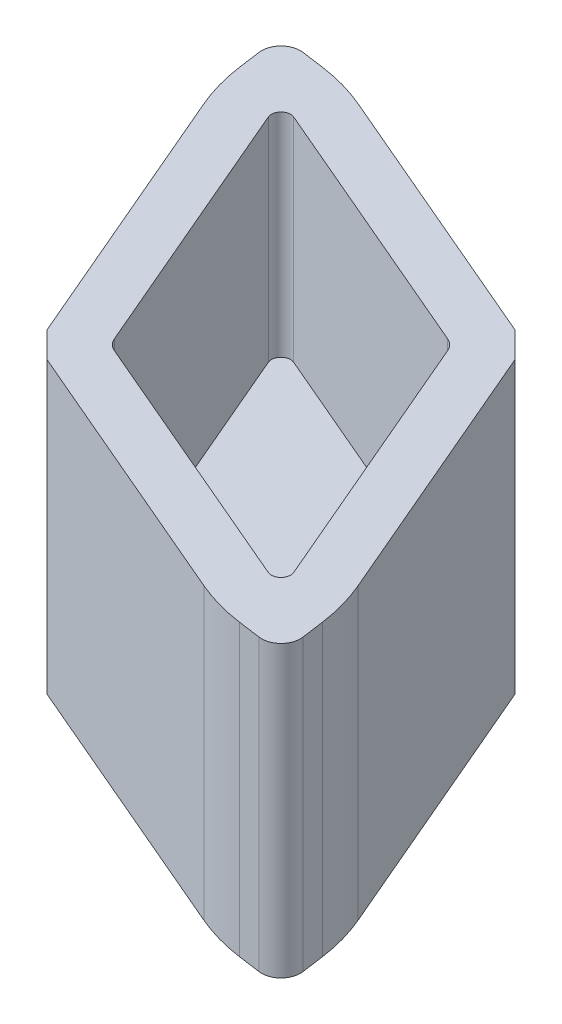
ISO-10303-21;
HEADER;
FILE_DESCRIPTION(('STEP AP214'),'2;1');
FILE_NAME('part.step','',(''),(''),'','','');
FILE_SCHEMA(('AUTOMOTIVE_DESIGN { 1 0 10303 214 1 1 1 1 }'));
ENDSEC;
DATA;
#1=APPLICATION_CONTEXT('core data for automotive mechanical design processes');
#2=APPLICATION_PROTOCOL_DEFINITION('international standard','automotive_design',2000,#1);
#3=PRODUCT_CONTEXT('',#1,'mechanical');
#4=PRODUCT('Part','Part','',(#3));
#5=PRODUCT_RELATED_PRODUCT_CATEGORY('part','',(#4));
#6=PRODUCT_DEFINITION_FORMATION('','',#4);
#7=PRODUCT_DEFINITION_CONTEXT('part definition',#1,'design');
#8=PRODUCT_DEFINITION('design','',#6,#7);
#9=PRODUCT_DEFINITION_SHAPE('','',#8);
#10=(LENGTH_UNIT() NAMED_UNIT(*) SI_UNIT(.MILLI.,.METRE.));
#11=(NAMED_UNIT(*) PLANE_ANGLE_UNIT() SI_UNIT($,.RADIAN.));
#12=(NAMED_UNIT(*) SI_UNIT($,.STERADIAN.) SOLID_ANGLE_UNIT());
#13=UNCERTAINTY_MEASURE_WITH_UNIT(LENGTH_MEASURE(1.E-05),#10,'distance_accuracy_value','');
#14=(GEOMETRIC_REPRESENTATION_CONTEXT(3) GLOBAL_UNCERTAINTY_ASSIGNED_CONTEXT((#13)) GLOBAL_UNIT_ASSIGNED_CONTEXT((#10,
#11,#12)) REPRESENTATION_CONTEXT('',''));
#15=CARTESIAN_POINT('',(0.,0.,0.));
#16=DIRECTION('',(0.,0.,1.));
#17=DIRECTION('',(1.,0.,0.));
#18=AXIS2_PLACEMENT_3D('',#15,#16,#17);
#19=CARTESIAN_POINT('',(-28.0411898687564,15.,-21.4741639325516));
#20=DIRECTION('',(0.,-1.,0.));
#21=DIRECTION('',(0.,0.,-1.));
#22=AXIS2_PLACEMENT_3D('',#19,#20,#21);
#23=CYLINDRICAL_SURFACE('',#22,10.);
#24=CARTESIAN_POINT('',(-28.0411898687564,0.,-21.4741639325516));
#25=DIRECTION('',(0.,1.,0.));
#26=DIRECTION('',(0.,0.,1.));
#27=AXIS2_PLACEMENT_3D('',#24,#25,#26);
#28=CIRCLE('',#27,10.);
#29=CARTESIAN_POINT('',(-37.9459062470632,0.,-20.0969952917164));
#30=VERTEX_POINT('',#29);
#31=CARTESIAN_POINT('',(-37.2348151155173,0.,-17.5400496965234));
#32=VERTEX_POINT('',#31);
#33=EDGE_CURVE('E369',#30,#32,#28,.T.);
#34=ORIENTED_EDGE('',*,*,#33,.T.);
#35=DIRECTION('',(0.,-1.,0.));
#36=VECTOR('',#35,1.);
#37=CARTESIAN_POINT('',(-37.2348151155173,15.,-17.5400496965234));
#38=LINE('',#37,#36);
#39=CARTESIAN_POINT('',(-37.2348151155173,15.,-17.5400496965234));
#40=VERTEX_POINT('',#39);
#41=EDGE_CURVE('E508',#40,#32,#38,.T.);
#42=ORIENTED_EDGE('',*,*,#41,.F.);
#43=CARTESIAN_POINT('',(-28.0411898687564,15.,-21.4741639325516));
#44=DIRECTION('',(0.,1.,0.));
#45=DIRECTION('',(0.,0.,1.));
#46=AXIS2_PLACEMENT_3D('',#43,#44,#45);
#47=CIRCLE('',#46,10.);
#48=CARTESIAN_POINT('',(-37.9459062470632,15.,-20.0969952917164));
#49=VERTEX_POINT('',#48);
#50=EDGE_CURVE('E390',#49,#40,#47,.T.);
#51=ORIENTED_EDGE('',*,*,#50,.F.);
#52=DIRECTION('',(0.,-1.,0.));
#53=VECTOR('',#52,1.);
#54=CARTESIAN_POINT('',(-37.9459062470632,15.,-20.0969952917164));
#55=LINE('',#54,#53);
#56=EDGE_CURVE('E432',#49,#30,#55,.T.);
#57=ORIENTED_EDGE('',*,*,#56,.T.);
#58=EDGE_LOOP('',(#34,#42,#51,#57));
#59=FACE_BOUND('',#58,.T.);
#60=ADVANCED_FACE('F104',(#59),#23,.T.);
#61=CARTESIAN_POINT('',(-37.2348151155173,15.,-17.5400496965234));
#62=DIRECTION('',(0.919362524676096,0.,-0.393411423602816));
#63=DIRECTION('',(-0.393411423602816,0.,-0.919362524676096));
#64=AXIS2_PLACEMENT_3D('',#61,#62,#63);
#65=PLANE('',#64);
#66=DIRECTION('',(0.393411423602816,0.,0.919362524676096));
#67=VECTOR('',#66,1.);
#68=CARTESIAN_POINT('',(-37.2348151155173,0.,-17.5400496965234));
#69=LINE('',#68,#67);
#70=CARTESIAN_POINT('',(-31.1500782062889,0.,-3.32063777495764));
#71=VERTEX_POINT('',#70);
#72=EDGE_CURVE('E435',#32,#71,#69,.T.);
#73=ORIENTED_EDGE('',*,*,#72,.T.);
#74=DIRECTION('',(0.,-1.,0.));
#75=VECTOR('',#74,1.);
#76=CARTESIAN_POINT('',(-31.1500782062889,15.,-3.32063777495764));
#77=LINE('',#76,#75);
#78=CARTESIAN_POINT('',(-31.1500782062889,15.,-3.32063777495764));
#79=VERTEX_POINT('',#78);
#80=EDGE_CURVE('E506',#79,#71,#77,.T.);
#81=ORIENTED_EDGE('',*,*,#80,.F.);
#82=DIRECTION('',(0.393411423602816,0.,0.919362524676096));
#83=VECTOR('',#82,1.);
#84=CARTESIAN_POINT('',(-37.2348151155173,15.,-17.5400496965234));
#85=LINE('',#84,#83);
#86=EDGE_CURVE('E393',#40,#79,#85,.T.);
#87=ORIENTED_EDGE('',*,*,#86,.F.);
#88=ORIENTED_EDGE('',*,*,#41,.T.);
#89=EDGE_LOOP('',(#73,#81,#87,#88));
#90=FACE_BOUND('',#89,.T.);
#91=ADVANCED_FACE('F544',(#90),#65,.F.);
#92=CARTESIAN_POINT('',(-29.8352004536057,15.,-2.00576002227444));
#93=DIRECTION('',(-0.707106781186545,0.,0.70710678118655));
#94=DIRECTION('',(0.70710678118655,0.,0.707106781186545));
#95=AXIS2_PLACEMENT_3D('',#92,#93,#94);
#96=PLANE('',#95);
#97=DIRECTION('',(-0.70710678118655,0.,-0.707106781186545));
#98=VECTOR('',#97,1.);
#99=CARTESIAN_POINT('',(-29.8352004536057,0.,-2.00576002227444));
#100=LINE('',#99,#98);
#101=CARTESIAN_POINT('',(-29.8352004536057,0.,-2.00576002227444));
#102=VERTEX_POINT('',#101);
#103=EDGE_CURVE('E438',#102,#71,#100,.T.);
#104=ORIENTED_EDGE('',*,*,#103,.F.);
#105=DIRECTION('',(0.,-1.,0.));
#106=VECTOR('',#105,1.);
#107=CARTESIAN_POINT('',(-29.8352004536057,15.,-2.00576002227444));
#108=LINE('',#107,#106);
#109=CARTESIAN_POINT('',(-29.8352004536057,15.,-2.00576002227444));
#110=VERTEX_POINT('',#109);
#111=EDGE_CURVE('E504',#110,#102,#108,.T.);
#112=ORIENTED_EDGE('',*,*,#111,.F.);
#113=DIRECTION('',(-0.70710678118655,0.,-0.707106781186545));
#114=VECTOR('',#113,1.);
#115=CARTESIAN_POINT('',(-29.8352004536057,15.,-2.00576002227444));
#116=LINE('',#115,#114);
#117=EDGE_CURVE('E396',#110,#79,#116,.T.);
#118=ORIENTED_EDGE('',*,*,#117,.T.);
#119=ORIENTED_EDGE('',*,*,#80,.T.);
#120=EDGE_LOOP('',(#104,#112,#118,#119));
#121=FACE_BOUND('',#120,.T.);
#122=ADVANCED_FACE('F549',(#121),#96,.T.);
#123=CARTESIAN_POINT('',(-29.8352004536057,15.,-2.00576002227444));
#124=DIRECTION('',(0.393411423602818,0.,-0.919362524676095));
#125=DIRECTION('',(-0.919362524676095,0.,-0.393411423602818));
#126=AXIS2_PLACEMENT_3D('',#123,#124,#125);
#127=PLANE('',#126);
#128=DIRECTION('',(0.919362524676095,0.,0.393411423602818));
#129=VECTOR('',#128,1.);
#130=CARTESIAN_POINT('',(-29.8352004536057,0.,-2.00576002227444));
#131=LINE('',#130,#129);
#132=CARTESIAN_POINT('',(-15.61578853204,0.,4.07897688695399));
#133=VERTEX_POINT('',#132);
#134=EDGE_CURVE('E441',#102,#133,#131,.T.);
#135=ORIENTED_EDGE('',*,*,#134,.T.);
#136=DIRECTION('',(0.,-1.,0.));
#137=VECTOR('',#136,1.);
#138=CARTESIAN_POINT('',(-15.61578853204,15.,4.07897688695399));
#139=LINE('',#138,#137);
#140=CARTESIAN_POINT('',(-15.61578853204,15.,4.07897688695399));
#141=VERTEX_POINT('',#140);
#142=EDGE_CURVE('E502',#141,#133,#139,.T.);
#143=ORIENTED_EDGE('',*,*,#142,.F.);
#144=DIRECTION('',(0.919362524676095,0.,0.393411423602818));
#145=VECTOR('',#144,1.);
#146=CARTESIAN_POINT('',(-29.8352004536057,15.,-2.00576002227444));
#147=LINE('',#146,#145);
#148=EDGE_CURVE('E399',#110,#141,#147,.T.);
#149=ORIENTED_EDGE('',*,*,#148,.F.);
#150=ORIENTED_EDGE('',*,*,#111,.T.);
#151=EDGE_LOOP('',(#135,#143,#149,#150));
#152=FACE_BOUND('',#151,.T.);
#153=ADVANCED_FACE('F615',(#152),#127,.F.);
#154=CARTESIAN_POINT('',(-11.6816742960118,15.,-5.11464835980695));
#155=DIRECTION('',(0.,-1.,0.));
#156=DIRECTION('',(0.,0.,-1.));
#157=AXIS2_PLACEMENT_3D('',#154,#155,#156);
#158=CYLINDRICAL_SURFACE('',#157,10.);
#159=CARTESIAN_POINT('',(-11.6816742960118,0.,-5.11464835980695));
#160=DIRECTION('',(0.,-1.,0.));
#161=DIRECTION('',(0.,0.,-1.));
#162=AXIS2_PLACEMENT_3D('',#159,#160,#161);
#163=CIRCLE('',#162,10.);
#164=CARTESIAN_POINT('',(-13.0588429368471,0.,4.79006801849989));
#165=VERTEX_POINT('',#164);
#166=EDGE_CURVE('E444',#165,#133,#163,.T.);
#167=ORIENTED_EDGE('',*,*,#166,.F.);
#168=DIRECTION('',(0.,-1.,0.));
#169=VECTOR('',#168,1.);
#170=CARTESIAN_POINT('',(-13.0588429368471,15.,4.79006801849989));
#171=LINE('',#170,#169);
#172=CARTESIAN_POINT('',(-13.0588429368471,15.,4.79006801849989));
#173=VERTEX_POINT('',#172);
#174=EDGE_CURVE('E500',#173,#165,#171,.T.);
#175=ORIENTED_EDGE('',*,*,#174,.F.);
#176=CARTESIAN_POINT('',(-11.6816742960118,15.,-5.11464835980695));
#177=DIRECTION('',(0.,-1.,0.));
#178=DIRECTION('',(0.,0.,-1.));
#179=AXIS2_PLACEMENT_3D('',#176,#177,#178);
#180=CIRCLE('',#179,10.);
#181=EDGE_CURVE('E401',#173,#141,#180,.T.);
#182=ORIENTED_EDGE('',*,*,#181,.T.);
#183=ORIENTED_EDGE('',*,*,#142,.T.);
#184=EDGE_LOOP('',(#167,#175,#182,#183));
#185=FACE_BOUND('',#184,.T.);
#186=ADVANCED_FACE('F609',(#185),#158,.T.);
#187=CARTESIAN_POINT('',(-13.0588429368471,15.,4.79006801849989));
#188=DIRECTION('',(0.137716864083533,0.,-0.990471637830684));
#189=DIRECTION('',(-0.990471637830684,0.,-0.137716864083533));
#190=AXIS2_PLACEMENT_3D('',#187,#188,#189);
#191=PLANE('',#190);
#192=DIRECTION('',(0.990471637830684,0.,0.137716864083533));
#193=VECTOR('',#192,1.);
#194=CARTESIAN_POINT('',(-13.0588429368471,0.,4.79006801849989));
#195=LINE('',#194,#193);
#196=CARTESIAN_POINT('',(-11.8833485347486,0.,4.95351076296788));
#197=VERTEX_POINT('',#196);
#198=EDGE_CURVE('E447',#165,#197,#195,.T.);
#199=ORIENTED_EDGE('',*,*,#198,.T.);
#200=DIRECTION('',(0.,-1.,0.));
#201=VECTOR('',#200,1.);
#202=CARTESIAN_POINT('',(-11.8833485347486,15.,4.95351076296788));
#203=LINE('',#202,#201);
#204=CARTESIAN_POINT('',(-11.8833485347486,15.,4.95351076296788));
#205=VERTEX_POINT('',#204);
#206=EDGE_CURVE('E498',#205,#197,#203,.T.);
#207=ORIENTED_EDGE('',*,*,#206,.F.);
#208=DIRECTION('',(0.990471637830684,0.,0.137716864083533));
#209=VECTOR('',#208,1.);
#210=CARTESIAN_POINT('',(-13.0588429368471,15.,4.79006801849989));
#211=LINE('',#210,#209);
#212=EDGE_CURVE('E404',#173,#205,#211,.T.);
#213=ORIENTED_EDGE('',*,*,#212,.F.);
#214=ORIENTED_EDGE('',*,*,#174,.T.);
#215=EDGE_LOOP('',(#199,#207,#213,#214));
#216=FACE_BOUND('',#215,.T.);
#217=ADVANCED_FACE('F617',(#216),#191,.F.);
#218=CARTESIAN_POINT('',(-11.7456316706651,15.,3.9630391251372));
#219=DIRECTION('',(0.,-1.,0.));
#220=DIRECTION('',(0.,0.,-1.));
#221=AXIS2_PLACEMENT_3D('',#218,#219,#220);
#222=CYLINDRICAL_SURFACE('',#221,1.);
#223=CARTESIAN_POINT('',(-11.7456316706651,0.,3.9630391251372));
#224=DIRECTION('',(0.,-1.,0.));
#225=DIRECTION('',(0.,0.,-1.));
#226=AXIS2_PLACEMENT_3D('',#223,#224,#225);
#227=CIRCLE('',#226,1.);
#228=CARTESIAN_POINT('',(-10.7551600328344,0.,3.82532226105365));
#229=VERTEX_POINT('',#228);
#230=EDGE_CURVE('E450',#229,#197,#227,.T.);
#231=ORIENTED_EDGE('',*,*,#230,.F.);
#232=DIRECTION('',(0.,-1.,0.));
#233=VECTOR('',#232,1.);
#234=CARTESIAN_POINT('',(-10.7551600328344,15.,3.82532226105365));
#235=LINE('',#234,#233);
#236=CARTESIAN_POINT('',(-10.7551600328344,15.,3.82532226105365));
#237=VERTEX_POINT('',#236);
#238=EDGE_CURVE('E496',#237,#229,#235,.T.);
#239=ORIENTED_EDGE('',*,*,#238,.F.);
#240=CARTESIAN_POINT('',(-11.7456316706651,15.,3.9630391251372));
#241=DIRECTION('',(0.,-1.,0.));
#242=DIRECTION('',(0.,0.,-1.));
#243=AXIS2_PLACEMENT_3D('',#240,#241,#242);
#244=CIRCLE('',#243,1.);
#245=EDGE_CURVE('E406',#237,#205,#244,.T.);
#246=ORIENTED_EDGE('',*,*,#245,.T.);
#247=ORIENTED_EDGE('',*,*,#206,.T.);
#248=EDGE_LOOP('',(#231,#239,#246,#247));
#249=FACE_BOUND('',#248,.T.);
#250=ADVANCED_FACE('F603',(#249),#222,.T.);
#251=CARTESIAN_POINT('',(-10.7551600328344,15.,3.82532226105365));
#252=DIRECTION('',(-0.990471637830683,0.,0.137716864083543));
#253=DIRECTION('',(0.137716864083543,0.,0.990471637830683));
#254=AXIS2_PLACEMENT_3D('',#251,#252,#253);
#255=PLANE('',#254);
#256=DIRECTION('',(-0.137716864083543,0.,-0.990471637830683));
#257=VECTOR('',#256,1.);
#258=CARTESIAN_POINT('',(-10.7551600328344,0.,3.82532226105365));
#259=LINE('',#258,#257);
#260=CARTESIAN_POINT('',(-10.9186027773024,0.,2.64982785895507));
#261=VERTEX_POINT('',#260);
#262=EDGE_CURVE('E453',#229,#261,#259,.T.);
#263=ORIENTED_EDGE('',*,*,#262,.T.);
#264=DIRECTION('',(0.,-1.,0.));
#265=VECTOR('',#264,1.);
#266=CARTESIAN_POINT('',(-10.9186027773024,15.,2.64982785895507));
#267=LINE('',#266,#265);
#268=CARTESIAN_POINT('',(-10.9186027773024,15.,2.64982785895507));
#269=VERTEX_POINT('',#268);
#270=EDGE_CURVE('E493',#269,#261,#267,.T.);
#271=ORIENTED_EDGE('',*,*,#270,.F.);
#272=DIRECTION('',(-0.137716864083543,0.,-0.990471637830683));
#273=VECTOR('',#272,1.);
#274=CARTESIAN_POINT('',(-10.7551600328344,15.,3.82532226105365));
#275=LINE('',#274,#273);
#276=EDGE_CURVE('E409',#237,#269,#275,.T.);
#277=ORIENTED_EDGE('',*,*,#276,.F.);
#278=ORIENTED_EDGE('',*,*,#238,.T.);
#279=EDGE_LOOP('',(#263,#271,#277,#278));
#280=FACE_BOUND('',#279,.T.);
#281=ADVANCED_FACE('F600',(#280),#255,.F.);
#282=CARTESIAN_POINT('',(-20.8233191556092,15.,4.02699649979045));
#283=DIRECTION('',(0.,-1.,0.));
#284=DIRECTION('',(0.,0.,-1.));
#285=AXIS2_PLACEMENT_3D('',#282,#283,#284);
#286=CYLINDRICAL_SURFACE('',#285,10.);
#287=CARTESIAN_POINT('',(-20.8233191556092,0.,4.02699649979045));
#288=DIRECTION('',(0.,1.,0.));
#289=DIRECTION('',(0.,0.,1.));
#290=AXIS2_PLACEMENT_3D('',#287,#288,#289);
#291=CIRCLE('',#290,10.);
#292=CARTESIAN_POINT('',(-11.6296939088483,0.,0.0928822637622697));
#293=VERTEX_POINT('',#292);
#294=EDGE_CURVE('E455',#261,#293,#291,.T.);
#295=ORIENTED_EDGE('',*,*,#294,.T.);
#296=DIRECTION('',(0.,-1.,0.));
#297=VECTOR('',#296,1.);
#298=CARTESIAN_POINT('',(-11.6296939088483,15.,0.0928822637622697));
#299=LINE('',#298,#297);
#300=CARTESIAN_POINT('',(-11.6296939088483,15.,0.0928822637622697));
#301=VERTEX_POINT('',#300);
#302=EDGE_CURVE('E491',#301,#293,#299,.T.);
#303=ORIENTED_EDGE('',*,*,#302,.F.);
#304=CARTESIAN_POINT('',(-20.8233191556092,15.,4.02699649979045));
#305=DIRECTION('',(0.,1.,0.));
#306=DIRECTION('',(0.,0.,1.));
#307=AXIS2_PLACEMENT_3D('',#304,#305,#306);
#308=CIRCLE('',#307,10.);
#309=EDGE_CURVE('E411',#269,#301,#308,.T.);
#310=ORIENTED_EDGE('',*,*,#309,.F.);
#311=ORIENTED_EDGE('',*,*,#270,.T.);
#312=EDGE_LOOP('',(#295,#303,#310,#311));
#313=FACE_BOUND('',#312,.T.);
#314=ADVANCED_FACE('F595',(#313),#286,.T.);
#315=CARTESIAN_POINT('',(-17.7144308180767,15.,-14.1265296578036));
#316=DIRECTION('',(0.919362524676095,0.,-0.393411423602818));
#317=DIRECTION('',(-0.393411423602818,0.,-0.919362524676095));
#318=AXIS2_PLACEMENT_3D('',#315,#316,#317);
#319=PLANE('',#318);
#320=DIRECTION('',(0.393411423602818,0.,0.919362524676095));
#321=VECTOR('',#320,1.);
#322=CARTESIAN_POINT('',(-17.7144308180767,0.,-14.1265296578036));
#323=LINE('',#322,#321);
#324=CARTESIAN_POINT('',(-17.7144308180767,0.,-14.1265296578036));
#325=VERTEX_POINT('',#324);
#326=EDGE_CURVE('E458',#325,#293,#323,.T.);
#327=ORIENTED_EDGE('',*,*,#326,.F.);
#328=DIRECTION('',(0.,-1.,0.));
#329=VECTOR('',#328,1.);
#330=CARTESIAN_POINT('',(-17.7144308180767,15.,-14.1265296578036));
#331=LINE('',#330,#329);
#332=CARTESIAN_POINT('',(-17.7144308180767,15.,-14.1265296578036));
#333=VERTEX_POINT('',#332);
#334=EDGE_CURVE('E489',#333,#325,#331,.T.);
#335=ORIENTED_EDGE('',*,*,#334,.F.);
#336=DIRECTION('',(0.393411423602818,0.,0.919362524676095));
#337=VECTOR('',#336,1.);
#338=CARTESIAN_POINT('',(-17.7144308180767,15.,-14.1265296578036));
#339=LINE('',#338,#337);
#340=EDGE_CURVE('E413',#333,#301,#339,.T.);
#341=ORIENTED_EDGE('',*,*,#340,.T.);
#342=ORIENTED_EDGE('',*,*,#302,.T.);
#343=EDGE_LOOP('',(#327,#335,#341,#342));
#344=FACE_BOUND('',#343,.T.);
#345=ADVANCED_FACE('F589',(#344),#319,.T.);
#346=CARTESIAN_POINT('',(-19.0293085707598,15.,-15.4414074104866));
#347=DIRECTION('',(0.70710678118653,0.,-0.707106781186565));
#348=DIRECTION('',(-0.707106781186565,0.,-0.70710678118653));
#349=AXIS2_PLACEMENT_3D('',#346,#347,#348);
#350=PLANE('',#349);
#351=DIRECTION('',(0.707106781186565,0.,0.70710678118653));
#352=VECTOR('',#351,1.);
#353=CARTESIAN_POINT('',(-19.0293085707598,0.,-15.4414074104866));
#354=LINE('',#353,#352);
#355=CARTESIAN_POINT('',(-19.0293085707598,0.,-15.4414074104866));
#356=VERTEX_POINT('',#355);
#357=EDGE_CURVE('E461',#356,#325,#354,.T.);
#358=ORIENTED_EDGE('',*,*,#357,.F.);
#359=DIRECTION('',(0.,-1.,0.));
#360=VECTOR('',#359,1.);
#361=CARTESIAN_POINT('',(-19.0293085707598,15.,-15.4414074104866));
#362=LINE('',#361,#360);
#363=CARTESIAN_POINT('',(-19.0293085707598,15.,-15.4414074104866));
#364=VERTEX_POINT('',#363);
#365=EDGE_CURVE('E487',#364,#356,#362,.T.);
#366=ORIENTED_EDGE('',*,*,#365,.F.);
#367=DIRECTION('',(0.707106781186565,0.,0.70710678118653));
#368=VECTOR('',#367,1.);
#369=CARTESIAN_POINT('',(-19.0293085707598,15.,-15.4414074104866));
#370=LINE('',#369,#368);
#371=EDGE_CURVE('E416',#364,#333,#370,.T.);
#372=ORIENTED_EDGE('',*,*,#371,.T.);
#373=ORIENTED_EDGE('',*,*,#334,.T.);
#374=EDGE_LOOP('',(#358,#366,#372,#373));
#375=FACE_BOUND('',#374,.T.);
#376=ADVANCED_FACE('F585',(#375),#350,.T.);
#377=CARTESIAN_POINT('',(-33.2487204923257,15.,-21.5261443197151));
#378=DIRECTION('',(0.39341142360282,0.,-0.919362524676095));
#379=DIRECTION('',(-0.919362524676095,0.,-0.39341142360282));
#380=AXIS2_PLACEMENT_3D('',#377,#378,#379);
#381=PLANE('',#380);
#382=DIRECTION('',(0.919362524676095,0.,0.39341142360282));
#383=VECTOR('',#382,1.);
#384=CARTESIAN_POINT('',(-33.2487204923257,0.,-21.5261443197151));
#385=LINE('',#384,#383);
#386=CARTESIAN_POINT('',(-33.2487204923257,0.,-21.5261443197151));
#387=VERTEX_POINT('',#386);
#388=EDGE_CURVE('E464',#387,#356,#385,.T.);
#389=ORIENTED_EDGE('',*,*,#388,.F.);
#390=DIRECTION('',(0.,-1.,0.));
#391=VECTOR('',#390,1.);
#392=CARTESIAN_POINT('',(-33.2487204923257,15.,-21.5261443197151));
#393=LINE('',#392,#391);
#394=CARTESIAN_POINT('',(-33.2487204923257,15.,-21.5261443197151));
#395=VERTEX_POINT('',#394);
#396=EDGE_CURVE('E485',#395,#387,#393,.T.);
#397=ORIENTED_EDGE('',*,*,#396,.F.);
#398=DIRECTION('',(0.919362524676095,0.,0.39341142360282));
#399=VECTOR('',#398,1.);
#400=CARTESIAN_POINT('',(-33.2487204923257,15.,-21.5261443197151));
#401=LINE('',#400,#399);
#402=EDGE_CURVE('E419',#395,#364,#401,.T.);
#403=ORIENTED_EDGE('',*,*,#402,.T.);
#404=ORIENTED_EDGE('',*,*,#365,.T.);
#405=EDGE_LOOP('',(#389,#397,#403,#404));
#406=FACE_BOUND('',#405,.T.);
#407=ADVANCED_FACE('F581',(#406),#381,.T.);
#408=CARTESIAN_POINT('',(-37.1828347283539,15.,-12.3325190729542));
#409=DIRECTION('',(0.,-1.,0.));
#410=DIRECTION('',(0.,0.,-1.));
#411=AXIS2_PLACEMENT_3D('',#408,#409,#410);
#412=CYLINDRICAL_SURFACE('',#411,10.);
#413=CARTESIAN_POINT('',(-37.1828347283539,0.,-12.3325190729542));
#414=DIRECTION('',(0.,-1.,0.));
#415=DIRECTION('',(0.,0.,-1.));
#416=AXIS2_PLACEMENT_3D('',#413,#414,#415);
#417=CIRCLE('',#416,10.);
#418=CARTESIAN_POINT('',(-35.8056660875186,0.,-22.237235451261));
#419=VERTEX_POINT('',#418);
#420=EDGE_CURVE('E467',#419,#387,#417,.T.);
#421=ORIENTED_EDGE('',*,*,#420,.F.);
#422=DIRECTION('',(0.,-1.,0.));
#423=VECTOR('',#422,1.);
#424=CARTESIAN_POINT('',(-35.8056660875186,15.,-22.237235451261));
#425=LINE('',#424,#423);
#426=CARTESIAN_POINT('',(-35.8056660875186,15.,-22.237235451261));
#427=VERTEX_POINT('',#426);
#428=EDGE_CURVE('E483',#427,#419,#425,.T.);
#429=ORIENTED_EDGE('',*,*,#428,.F.);
#430=CARTESIAN_POINT('',(-37.1828347283539,15.,-12.3325190729542));
#431=DIRECTION('',(0.,-1.,0.));
#432=DIRECTION('',(0.,0.,-1.));
#433=AXIS2_PLACEMENT_3D('',#430,#431,#432);
#434=CIRCLE('',#433,10.);
#435=EDGE_CURVE('E422',#427,#395,#434,.T.);
#436=ORIENTED_EDGE('',*,*,#435,.T.);
#437=ORIENTED_EDGE('',*,*,#396,.T.);
#438=EDGE_LOOP('',(#421,#429,#436,#437));
#439=FACE_BOUND('',#438,.T.);
#440=ADVANCED_FACE('F577',(#439),#412,.T.);
#441=CARTESIAN_POINT('',(-36.981160489617,15.,-22.400678195729));
#442=DIRECTION('',(0.137716864083534,0.,-0.990471637830684));
#443=DIRECTION('',(-0.990471637830684,0.,-0.137716864083534));
#444=AXIS2_PLACEMENT_3D('',#441,#442,#443);
#445=PLANE('',#444);
#446=DIRECTION('',(0.990471637830684,0.,0.137716864083534));
#447=VECTOR('',#446,1.);
#448=CARTESIAN_POINT('',(-36.981160489617,0.,-22.400678195729));
#449=LINE('',#448,#447);
#450=CARTESIAN_POINT('',(-36.981160489617,0.,-22.400678195729));
#451=VERTEX_POINT('',#450);
#452=EDGE_CURVE('E470',#451,#419,#449,.T.);
#453=ORIENTED_EDGE('',*,*,#452,.F.);
#454=DIRECTION('',(0.,-1.,0.));
#455=VECTOR('',#454,1.);
#456=CARTESIAN_POINT('',(-36.981160489617,15.,-22.400678195729));
#457=LINE('',#456,#455);
#458=CARTESIAN_POINT('',(-36.981160489617,15.,-22.400678195729));
#459=VERTEX_POINT('',#458);
#460=EDGE_CURVE('E481',#459,#451,#457,.T.);
#461=ORIENTED_EDGE('',*,*,#460,.F.);
#462=DIRECTION('',(0.990471637830684,0.,0.137716864083534));
#463=VECTOR('',#462,1.);
#464=CARTESIAN_POINT('',(-36.981160489617,15.,-22.400678195729));
#465=LINE('',#464,#463);
#466=EDGE_CURVE('E425',#459,#427,#465,.T.);
#467=ORIENTED_EDGE('',*,*,#466,.T.);
#468=ORIENTED_EDGE('',*,*,#428,.T.);
#469=EDGE_LOOP('',(#453,#461,#467,#468));
#470=FACE_BOUND('',#469,.T.);
#471=ADVANCED_FACE('F573',(#470),#445,.T.);
#472=CARTESIAN_POINT('',(-37.1188773537005,15.,-21.4102065578983));
#473=DIRECTION('',(0.,-1.,0.));
#474=DIRECTION('',(0.,0.,-1.));
#475=AXIS2_PLACEMENT_3D('',#472,#473,#474);
#476=CYLINDRICAL_SURFACE('',#475,1.);
#477=CARTESIAN_POINT('',(-37.1188773537005,0.,-21.4102065578983));
#478=DIRECTION('',(0.,1.,0.));
#479=DIRECTION('',(0.,0.,1.));
#480=AXIS2_PLACEMENT_3D('',#477,#478,#479);
#481=CIRCLE('',#480,1.);
#482=CARTESIAN_POINT('',(-38.1093489915312,0.,-21.2724896938148));
#483=VERTEX_POINT('',#482);
#484=EDGE_CURVE('E473',#451,#483,#481,.T.);
#485=ORIENTED_EDGE('',*,*,#484,.T.);
#486=DIRECTION('',(0.,-1.,0.));
#487=VECTOR('',#486,1.);
#488=CARTESIAN_POINT('',(-38.1093489915312,15.,-21.2724896938148));
#489=LINE('',#488,#487);
#490=CARTESIAN_POINT('',(-38.1093489915312,15.,-21.2724896938148));
#491=VERTEX_POINT('',#490);
#492=EDGE_CURVE('E478',#491,#483,#489,.T.);
#493=ORIENTED_EDGE('',*,*,#492,.F.);
#494=CARTESIAN_POINT('',(-37.1188773537005,15.,-21.4102065578983));
#495=DIRECTION('',(0.,1.,0.));
#496=DIRECTION('',(0.,0.,1.));
#497=AXIS2_PLACEMENT_3D('',#494,#495,#496);
#498=CIRCLE('',#497,1.);
#499=EDGE_CURVE('E428',#459,#491,#498,.T.);
#500=ORIENTED_EDGE('',*,*,#499,.F.);
#501=ORIENTED_EDGE('',*,*,#460,.T.);
#502=EDGE_LOOP('',(#485,#493,#500,#501));
#503=FACE_BOUND('',#502,.T.);
#504=ADVANCED_FACE('F570',(#503),#476,.T.);
#505=CARTESIAN_POINT('',(-38.1093489915312,15.,-21.2724896938148));
#506=DIRECTION('',(0.990471637830685,0.,-0.137716864083527));
#507=DIRECTION('',(-0.137716864083527,0.,-0.990471637830685));
#508=AXIS2_PLACEMENT_3D('',#505,#506,#507);
#509=PLANE('',#508);
#510=DIRECTION('',(0.137716864083527,0.,0.990471637830685));
#511=VECTOR('',#510,1.);
#512=CARTESIAN_POINT('',(-38.1093489915312,0.,-21.2724896938148));
#513=LINE('',#512,#511);
#514=EDGE_CURVE('E394',#483,#30,#513,.T.);
#515=ORIENTED_EDGE('',*,*,#514,.T.);
#516=ORIENTED_EDGE('',*,*,#56,.F.);
#517=DIRECTION('',(0.137716864083527,0.,0.990471637830685));
#518=VECTOR('',#517,1.);
#519=CARTESIAN_POINT('',(-38.1093489915312,15.,-21.2724896938148));
#520=LINE('',#519,#518);
#521=EDGE_CURVE('E430',#491,#49,#520,.T.);
#522=ORIENTED_EDGE('',*,*,#521,.F.);
#523=ORIENTED_EDGE('',*,*,#492,.T.);
#524=EDGE_LOOP('',(#515,#516,#522,#523));
#525=FACE_BOUND('',#524,.T.);
#526=ADVANCED_FACE('F568',(#525),#509,.F.);
#527=CARTESIAN_POINT('',(-28.0411898687564,15.,-21.4741639325516));
#528=DIRECTION('',(0.,1.,0.));
#529=DIRECTION('',(0.,0.,1.));
#530=AXIS2_PLACEMENT_3D('',#527,#528,#529);
#531=PLANE('',#530);
#532=CARTESIAN_POINT('',(-34.5124615796985,15.,-18.8037907838964));
#533=DIRECTION('',(0.,-1.,0.));
#534=DIRECTION('',(0.,0.,-1.));
#535=AXIS2_PLACEMENT_3D('',#532,#533,#534);
#536=CIRCLE('',#535,0.499999999999999);
#537=CARTESIAN_POINT('',(-34.9721428420366,15.,-18.607085072095));
#538=VERTEX_POINT('',#537);
#539=CARTESIAN_POINT('',(-34.3157558678971,15.,-19.2634720462344));
#540=VERTEX_POINT('',#539);
#541=EDGE_CURVE('E343',#538,#540,#536,.T.);
#542=ORIENTED_EDGE('',*,*,#541,.T.);
#543=DIRECTION('',(0.919362524676095,0.,0.393411423602819));
#544=VECTOR('',#543,1.);
#545=CARTESIAN_POINT('',(-34.3157558678971,15.,-19.2634720462344));
#546=LINE('',#545,#544);
#547=CARTESIAN_POINT('',(-20.381171474589,15.,-13.3006178550476));
#548=VERTEX_POINT('',#547);
#549=EDGE_CURVE('E346',#540,#548,#546,.T.);
#550=ORIENTED_EDGE('',*,*,#549,.T.);
#551=CARTESIAN_POINT('',(-20.7745828981919,15.,-12.3812553303715));
#552=DIRECTION('',(0.,-1.,0.));
#553=DIRECTION('',(0.,0.,-1.));
#554=AXIS2_PLACEMENT_3D('',#551,#552,#553);
#555=CIRCLE('',#554,0.999999999999998);
#556=CARTESIAN_POINT('',(-19.8552203735158,15.,-12.7746667539743));
#557=VERTEX_POINT('',#556);
#558=EDGE_CURVE('E349',#548,#557,#555,.T.);
#559=ORIENTED_EDGE('',*,*,#558,.T.);
#560=DIRECTION('',(0.393411423602817,0.,0.919362524676096));
#561=VECTOR('',#560,1.);
#562=CARTESIAN_POINT('',(-19.8552203735158,15.,-12.7746667539743));
#563=LINE('',#562,#561);
#564=CARTESIAN_POINT('',(-13.892366182329,15.,1.15991763933381));
#565=VERTEX_POINT('',#564);
#566=EDGE_CURVE('E352',#557,#565,#563,.T.);
#567=ORIENTED_EDGE('',*,*,#566,.T.);
#568=CARTESIAN_POINT('',(-14.352047444667,15.,1.35662335113523));
#569=DIRECTION('',(0.,1.,0.));
#570=DIRECTION('',(0.,0.,1.));
#571=AXIS2_PLACEMENT_3D('',#568,#569,#570);
#572=CIRCLE('',#571,0.5);
#573=CARTESIAN_POINT('',(-14.5487531564684,15.,1.81630461347328));
#574=VERTEX_POINT('',#573);
#575=EDGE_CURVE('E355',#574,#565,#572,.T.);
#576=ORIENTED_EDGE('',*,*,#575,.F.);
#577=DIRECTION('',(-0.919362524676094,0.,-0.39341142360282));
#578=VECTOR('',#577,1.);
#579=CARTESIAN_POINT('',(-14.5487531564684,15.,1.81630461347328));
#580=LINE('',#579,#578);
#581=CARTESIAN_POINT('',(-28.4833375497765,15.,-4.14654957771358));
#582=VERTEX_POINT('',#581);
#583=EDGE_CURVE('E357',#574,#582,#580,.T.);
#584=ORIENTED_EDGE('',*,*,#583,.T.);
#585=CARTESIAN_POINT('',(-28.0899261261737,15.,-5.06591210238967));
#586=DIRECTION('',(0.,-1.,0.));
#587=DIRECTION('',(0.,0.,-1.));
#588=AXIS2_PLACEMENT_3D('',#585,#586,#587);
#589=CIRCLE('',#588,1.);
#590=CARTESIAN_POINT('',(-29.0092886508498,15.,-4.67250067878686));
#591=VERTEX_POINT('',#590);
#592=EDGE_CURVE('E360',#582,#591,#589,.T.);
#593=ORIENTED_EDGE('',*,*,#592,.T.);
#594=DIRECTION('',(0.393411423602817,0.,0.919362524676096));
#595=VECTOR('',#594,1.);
#596=CARTESIAN_POINT('',(-34.9721428420366,15.,-18.607085072095));
#597=LINE('',#596,#595);
#598=EDGE_CURVE('E363',#538,#591,#597,.T.);
#599=ORIENTED_EDGE('',*,*,#598,.F.);
#600=EDGE_LOOP('',(#542,#550,#559,#567,#576,#584,#593,#599));
#601=FACE_BOUND('',#600,.T.);
#602=ORIENTED_EDGE('',*,*,#50,.T.);
#603=ORIENTED_EDGE('',*,*,#86,.T.);
#604=ORIENTED_EDGE('',*,*,#117,.F.);
#605=ORIENTED_EDGE('',*,*,#148,.T.);
#606=ORIENTED_EDGE('',*,*,#181,.F.);
#607=ORIENTED_EDGE('',*,*,#212,.T.);
#608=ORIENTED_EDGE('',*,*,#245,.F.);
#609=ORIENTED_EDGE('',*,*,#276,.T.);
#610=ORIENTED_EDGE('',*,*,#309,.T.);
#611=ORIENTED_EDGE('',*,*,#340,.F.);
#612=ORIENTED_EDGE('',*,*,#371,.F.);
#613=ORIENTED_EDGE('',*,*,#402,.F.);
#614=ORIENTED_EDGE('',*,*,#435,.F.);
#615=ORIENTED_EDGE('',*,*,#466,.F.);
#616=ORIENTED_EDGE('',*,*,#499,.T.);
#617=ORIENTED_EDGE('',*,*,#521,.T.);
#618=EDGE_LOOP('',(#602,#603,#604,#605,#606,#607,#608,#609,#610,#611,#612,#613,#614,#615,#616,#617));
#619=FACE_BOUND('',#618,.T.);
#620=ADVANCED_FACE('F562',(#601,#619),#531,.T.);
#621=CARTESIAN_POINT('',(-28.0411898687564,0.,-21.4741639325516));
#622=DIRECTION('',(0.,1.,0.));
#623=DIRECTION('',(0.,0.,1.));
#624=AXIS2_PLACEMENT_3D('',#621,#622,#623);
#625=PLANE('',#624);
#626=DIRECTION('',(0.938431418926496,0.,0.345465587246551));
#627=VECTOR('',#626,1.);
#628=CARTESIAN_POINT('',(-34.2343746042675,0.,-4.65084099222113));
#629=LINE('',#628,#627);
#630=CARTESIAN_POINT('',(-29.4926926885068,0.,-2.90528143983693));
#631=VERTEX_POINT('',#630);
#632=CARTESIAN_POINT('',(-12.8652167067003,0.,3.21580598182436));
#633=VERTEX_POINT('',#632);
#634=EDGE_CURVE('E513',#631,#633,#629,.T.);
#635=ORIENTED_EDGE('',*,*,#634,.T.);
#636=DIRECTION('',(-0.334172662683435,0.,-0.942511873408003));
#637=VECTOR('',#636,1.);
#638=CARTESIAN_POINT('',(-22.3363333529383,0.,-23.4968515462626));
#639=LINE('',#638,#637);
#640=CARTESIAN_POINT('',(-18.9099520525815,0.,-13.8329699095152));
#641=VERTEX_POINT('',#640);
#642=EDGE_CURVE('E12',#633,#641,#639,.T.);
#643=ORIENTED_EDGE('',*,*,#642,.T.);
#644=DIRECTION('',(-0.908148679362959,0.,-0.418647794896037));
#645=VECTOR('',#644,1.);
#646=CARTESIAN_POINT('',(-29.3459340574595,0.,-18.6438571058514));
#647=LINE('',#646,#645);
#648=CARTESIAN_POINT('',(-32.1738463111956,0.,-19.94749741948));
#649=VERTEX_POINT('',#648);
#650=EDGE_CURVE('E111',#641,#649,#647,.T.);
#651=ORIENTED_EDGE('',*,*,#650,.T.);
#652=DIRECTION('',(-1.,0.,0.));
#653=VECTOR('',#652,1.);
#654=CARTESIAN_POINT('',(-28.0411898687564,0.,-19.94749741948));
#655=LINE('',#654,#653);
#656=CARTESIAN_POINT('',(-36.4840141970149,0.,-19.94749741948));
#657=VERTEX_POINT('',#656);
#658=EDGE_CURVE('E518',#649,#657,#655,.T.);
#659=ORIENTED_EDGE('',*,*,#658,.T.);
#660=DIRECTION('',(0.379539774997088,0.,0.925175420769035));
#661=VECTOR('',#660,1.);
#662=CARTESIAN_POINT('',(-35.803896640066,0.,-18.2896262597909));
#663=LINE('',#662,#661);
#664=EDGE_CURVE('E515',#657,#631,#663,.T.);
#665=ORIENTED_EDGE('',*,*,#664,.T.);
#666=EDGE_LOOP('',(#635,#643,#651,#659,#665));
#667=FACE_BOUND('',#666,.T.);
#668=ORIENTED_EDGE('',*,*,#33,.F.);
#669=ORIENTED_EDGE('',*,*,#514,.F.);
#670=ORIENTED_EDGE('',*,*,#484,.F.);
#671=ORIENTED_EDGE('',*,*,#452,.T.);
#672=ORIENTED_EDGE('',*,*,#420,.T.);
#673=ORIENTED_EDGE('',*,*,#388,.T.);
#674=ORIENTED_EDGE('',*,*,#357,.T.);
#675=ORIENTED_EDGE('',*,*,#326,.T.);
#676=ORIENTED_EDGE('',*,*,#294,.F.);
#677=ORIENTED_EDGE('',*,*,#262,.F.);
#678=ORIENTED_EDGE('',*,*,#230,.T.);
#679=ORIENTED_EDGE('',*,*,#198,.F.);
#680=ORIENTED_EDGE('',*,*,#166,.T.);
#681=ORIENTED_EDGE('',*,*,#134,.F.);
#682=ORIENTED_EDGE('',*,*,#103,.T.);
#683=ORIENTED_EDGE('',*,*,#72,.F.);
#684=EDGE_LOOP('',(#668,#669,#670,#671,#672,#673,#674,#675,#676,#677,#678,#679,#680,#681,#682,#683));
#685=FACE_BOUND('',#684,.T.);
#686=ADVANCED_FACE('F526',(#667,#685),#625,.F.);
#687=CARTESIAN_POINT('',(-34.5124615796985,15.,-18.8037907838964));
#688=DIRECTION('',(0.,-1.,0.));
#689=DIRECTION('',(0.,0.,-1.));
#690=AXIS2_PLACEMENT_3D('',#687,#688,#689);
#691=CYLINDRICAL_SURFACE('',#690,0.499999999999999);
#692=DIRECTION('',(0.,-1.,0.));
#693=VECTOR('',#692,1.);
#694=CARTESIAN_POINT('',(-34.9721428420366,15.,-18.607085072095));
#695=LINE('',#694,#693);
#696=CARTESIAN_POINT('',(-34.9721428420366,4.,-18.607085072095));
#697=VERTEX_POINT('',#696);
#698=EDGE_CURVE('E366',#538,#697,#695,.T.);
#699=ORIENTED_EDGE('',*,*,#698,.T.);
#700=CARTESIAN_POINT('',(-34.5124615796985,4.,-18.8037907838964));
#701=DIRECTION('',(0.,1.,0.));
#702=DIRECTION('',(0.,0.,1.));
#703=AXIS2_PLACEMENT_3D('',#700,#701,#702);
#704=CIRCLE('',#703,0.499999999999999);
#705=CARTESIAN_POINT('',(-34.3157558678971,4.,-19.2634720462344));
#706=VERTEX_POINT('',#705);
#707=EDGE_CURVE('E340',#697,#706,#704,.F.);
#708=ORIENTED_EDGE('',*,*,#707,.T.);
#709=DIRECTION('',(0.,-1.,0.));
#710=VECTOR('',#709,1.);
#711=CARTESIAN_POINT('',(-34.3157558678971,15.,-19.2634720462344));
#712=LINE('',#711,#710);
#713=EDGE_CURVE('E365',#540,#706,#712,.T.);
#714=ORIENTED_EDGE('',*,*,#713,.F.);
#715=ORIENTED_EDGE('',*,*,#541,.F.);
#716=EDGE_LOOP('',(#699,#708,#714,#715));
#717=FACE_BOUND('',#716,.T.);
#718=ADVANCED_FACE('F742',(#717),#691,.F.);
#719=CARTESIAN_POINT('',(-34.9721428420366,15.,-18.607085072095));
#720=DIRECTION('',(0.919362524676096,0.,-0.393411423602817));
#721=DIRECTION('',(-0.393411423602817,0.,-0.919362524676096));
#722=AXIS2_PLACEMENT_3D('',#719,#720,#721);
#723=PLANE('',#722);
#724=DIRECTION('',(0.393411423602817,0.,0.919362524676096));
#725=VECTOR('',#724,1.);
#726=CARTESIAN_POINT('',(-34.9721428420366,4.,-18.607085072095));
#727=LINE('',#726,#725);
#728=CARTESIAN_POINT('',(-29.0092886508498,4.,-4.67250067878686));
#729=VERTEX_POINT('',#728);
#730=EDGE_CURVE('E338',#697,#729,#727,.T.);
#731=ORIENTED_EDGE('',*,*,#730,.F.);
#732=ORIENTED_EDGE('',*,*,#698,.F.);
#733=ORIENTED_EDGE('',*,*,#598,.T.);
#734=DIRECTION('',(0.,-1.,0.));
#735=VECTOR('',#734,1.);
#736=CARTESIAN_POINT('',(-29.0092886508498,15.,-4.67250067878686));
#737=LINE('',#736,#735);
#738=EDGE_CURVE('E370',#591,#729,#737,.T.);
#739=ORIENTED_EDGE('',*,*,#738,.T.);
#740=EDGE_LOOP('',(#731,#732,#733,#739));
#741=FACE_BOUND('',#740,.T.);
#742=ADVANCED_FACE('F748',(#741),#723,.T.);
#743=CARTESIAN_POINT('',(-28.0899261261737,15.,-5.06591210238967));
#744=DIRECTION('',(0.,-1.,0.));
#745=DIRECTION('',(0.,0.,-1.));
#746=AXIS2_PLACEMENT_3D('',#743,#744,#745);
#747=CYLINDRICAL_SURFACE('',#746,1.);
#748=DIRECTION('',(0.,-1.,0.));
#749=VECTOR('',#748,1.);
#750=CARTESIAN_POINT('',(-28.4833375497765,15.,-4.14654957771358));
#751=LINE('',#750,#749);
#752=CARTESIAN_POINT('',(-28.4833375497765,4.,-4.14654957771358));
#753=VERTEX_POINT('',#752);
#754=EDGE_CURVE('E373',#582,#753,#751,.T.);
#755=ORIENTED_EDGE('',*,*,#754,.T.);
#756=CARTESIAN_POINT('',(-28.0899261261737,4.,-5.06591210238967));
#757=DIRECTION('',(0.,1.,0.));
#758=DIRECTION('',(0.,0.,1.));
#759=AXIS2_PLACEMENT_3D('',#756,#757,#758);
#760=CIRCLE('',#759,1.);
#761=EDGE_CURVE('E335',#753,#729,#760,.F.);
#762=ORIENTED_EDGE('',*,*,#761,.T.);
#763=ORIENTED_EDGE('',*,*,#738,.F.);
#764=ORIENTED_EDGE('',*,*,#592,.F.);
#765=EDGE_LOOP('',(#755,#762,#763,#764));
#766=FACE_BOUND('',#765,.T.);
#767=ADVANCED_FACE('F756',(#766),#747,.F.);
#768=CARTESIAN_POINT('',(-14.5487531564684,15.,1.81630461347328));
#769=DIRECTION('',(-0.39341142360282,0.,0.919362524676094));
#770=DIRECTION('',(0.919362524676095,0.,0.39341142360282));
#771=AXIS2_PLACEMENT_3D('',#768,#769,#770);
#772=PLANE('',#771);
#773=DIRECTION('',(0.,-1.,0.));
#774=VECTOR('',#773,1.);
#775=CARTESIAN_POINT('',(-14.5487531564684,15.,1.81630461347328));
#776=LINE('',#775,#774);
#777=CARTESIAN_POINT('',(-14.5487531564684,4.,1.81630461347327));
#778=VERTEX_POINT('',#777);
#779=EDGE_CURVE('E376',#574,#778,#776,.T.);
#780=ORIENTED_EDGE('',*,*,#779,.T.);
#781=DIRECTION('',(-0.919362524676095,0.,-0.39341142360282));
#782=VECTOR('',#781,1.);
#783=CARTESIAN_POINT('',(-14.5487531564684,4.,1.81630461347328));
#784=LINE('',#783,#782);
#785=EDGE_CURVE('E332',#778,#753,#784,.T.);
#786=ORIENTED_EDGE('',*,*,#785,.T.);
#787=ORIENTED_EDGE('',*,*,#754,.F.);
#788=ORIENTED_EDGE('',*,*,#583,.F.);
#789=EDGE_LOOP('',(#780,#786,#787,#788));
#790=FACE_BOUND('',#789,.T.);
#791=ADVANCED_FACE('F764',(#790),#772,.F.);
#792=CARTESIAN_POINT('',(-14.352047444667,15.,1.35662335113523));
#793=DIRECTION('',(0.,-1.,0.));
#794=DIRECTION('',(0.,0.,-1.));
#795=AXIS2_PLACEMENT_3D('',#792,#793,#794);
#796=CYLINDRICAL_SURFACE('',#795,0.5);
#797=CARTESIAN_POINT('',(-14.352047444667,4.,1.35662335113523));
#798=DIRECTION('',(0.,1.,0.));
#799=DIRECTION('',(0.,0.,1.));
#800=AXIS2_PLACEMENT_3D('',#797,#798,#799);
#801=CIRCLE('',#800,0.5);
#802=CARTESIAN_POINT('',(-13.892366182329,4.,1.15991763933381));
#803=VERTEX_POINT('',#802);
#804=EDGE_CURVE('E330',#778,#803,#801,.T.);
#805=ORIENTED_EDGE('',*,*,#804,.F.);
#806=ORIENTED_EDGE('',*,*,#779,.F.);
#807=ORIENTED_EDGE('',*,*,#575,.T.);
#808=DIRECTION('',(0.,-1.,0.));
#809=VECTOR('',#808,1.);
#810=CARTESIAN_POINT('',(-13.892366182329,15.,1.15991763933381));
#811=LINE('',#810,#809);
#812=EDGE_CURVE('E379',#565,#803,#811,.T.);
#813=ORIENTED_EDGE('',*,*,#812,.T.);
#814=EDGE_LOOP('',(#805,#806,#807,#813));
#815=FACE_BOUND('',#814,.T.);
#816=ADVANCED_FACE('F772',(#815),#796,.F.);
#817=CARTESIAN_POINT('',(-19.8552203735158,15.,-12.7746667539743));
#818=DIRECTION('',(0.919362524676096,0.,-0.393411423602817));
#819=DIRECTION('',(-0.393411423602817,0.,-0.919362524676096));
#820=AXIS2_PLACEMENT_3D('',#817,#818,#819);
#821=PLANE('',#820);
#822=DIRECTION('',(0.,-1.,0.));
#823=VECTOR('',#822,1.);
#824=CARTESIAN_POINT('',(-19.8552203735158,15.,-12.7746667539743));
#825=LINE('',#824,#823);
#826=CARTESIAN_POINT('',(-19.8552203735158,4.,-12.7746667539743));
#827=VERTEX_POINT('',#826);
#828=EDGE_CURVE('E382',#557,#827,#825,.T.);
#829=ORIENTED_EDGE('',*,*,#828,.T.);
#830=DIRECTION('',(0.393411423602817,0.,0.919362524676096));
#831=VECTOR('',#830,1.);
#832=CARTESIAN_POINT('',(-19.8552203735158,4.,-12.7746667539743));
#833=LINE('',#832,#831);
#834=EDGE_CURVE('E327',#827,#803,#833,.T.);
#835=ORIENTED_EDGE('',*,*,#834,.T.);
#836=ORIENTED_EDGE('',*,*,#812,.F.);
#837=ORIENTED_EDGE('',*,*,#566,.F.);
#838=EDGE_LOOP('',(#829,#835,#836,#837));
#839=FACE_BOUND('',#838,.T.);
#840=ADVANCED_FACE('F780',(#839),#821,.F.);
#841=CARTESIAN_POINT('',(-20.7745828981919,15.,-12.3812553303715));
#842=DIRECTION('',(0.,-1.,0.));
#843=DIRECTION('',(0.,0.,-1.));
#844=AXIS2_PLACEMENT_3D('',#841,#842,#843);
#845=CYLINDRICAL_SURFACE('',#844,0.999999999999998);
#846=DIRECTION('',(0.,-1.,0.));
#847=VECTOR('',#846,1.);
#848=CARTESIAN_POINT('',(-20.381171474589,15.,-13.3006178550476));
#849=LINE('',#848,#847);
#850=CARTESIAN_POINT('',(-20.381171474589,4.,-13.3006178550476));
#851=VERTEX_POINT('',#850);
#852=EDGE_CURVE('E385',#548,#851,#849,.T.);
#853=ORIENTED_EDGE('',*,*,#852,.T.);
#854=CARTESIAN_POINT('',(-20.7745828981919,4.,-12.3812553303715));
#855=DIRECTION('',(0.,1.,0.));
#856=DIRECTION('',(0.,0.,1.));
#857=AXIS2_PLACEMENT_3D('',#854,#855,#856);
#858=CIRCLE('',#857,0.999999999999998);
#859=EDGE_CURVE('E126',#851,#827,#858,.F.);
#860=ORIENTED_EDGE('',*,*,#859,.T.);
#861=ORIENTED_EDGE('',*,*,#828,.F.);
#862=ORIENTED_EDGE('',*,*,#558,.F.);
#863=EDGE_LOOP('',(#853,#860,#861,#862));
#864=FACE_BOUND('',#863,.T.);
#865=ADVANCED_FACE('F788',(#864),#845,.F.);
#866=CARTESIAN_POINT('',(-34.3157558678971,15.,-19.2634720462344));
#867=DIRECTION('',(0.393411423602819,0.,-0.919362524676095));
#868=DIRECTION('',(-0.919362524676095,0.,-0.393411423602819));
#869=AXIS2_PLACEMENT_3D('',#866,#867,#868);
#870=PLANE('',#869);
#871=ORIENTED_EDGE('',*,*,#713,.T.);
#872=DIRECTION('',(0.919362524676095,0.,0.393411423602819));
#873=VECTOR('',#872,1.);
#874=CARTESIAN_POINT('',(-34.3157558678971,4.,-19.2634720462344));
#875=LINE('',#874,#873);
#876=EDGE_CURVE('E511',#706,#851,#875,.T.);
#877=ORIENTED_EDGE('',*,*,#876,.T.);
#878=ORIENTED_EDGE('',*,*,#852,.F.);
#879=ORIENTED_EDGE('',*,*,#549,.F.);
#880=EDGE_LOOP('',(#871,#877,#878,#879));
#881=FACE_BOUND('',#880,.T.);
#882=ADVANCED_FACE('F796',(#881),#870,.F.);
#883=CARTESIAN_POINT('',(0.,4.,0.));
#884=DIRECTION('',(0.,1.,0.));
#885=DIRECTION('',(0.,0.,1.));
#886=AXIS2_PLACEMENT_3D('',#883,#884,#885);
#887=PLANE('',#886);
#888=ORIENTED_EDGE('',*,*,#707,.F.);
#889=ORIENTED_EDGE('',*,*,#730,.T.);
#890=ORIENTED_EDGE('',*,*,#761,.F.);
#891=ORIENTED_EDGE('',*,*,#785,.F.);
#892=ORIENTED_EDGE('',*,*,#804,.T.);
#893=ORIENTED_EDGE('',*,*,#834,.F.);
#894=ORIENTED_EDGE('',*,*,#859,.F.);
#895=ORIENTED_EDGE('',*,*,#876,.F.);
#896=EDGE_LOOP('',(#888,#889,#890,#891,#892,#893,#894,#895));
#897=FACE_BOUND('',#896,.T.);
#898=ADVANCED_FACE('F540',(#897),#887,.T.);
#899=CARTESIAN_POINT('',(-18.9099520525815,4.,-13.8329699095152));
#900=DIRECTION('',(0.942511873408003,0.,-0.334172662683435));
#901=DIRECTION('',(-0.334172662683435,0.,-0.942511873408003));
#902=AXIS2_PLACEMENT_3D('',#899,#900,#901);
#903=PLANE('',#902);
#904=ORIENTED_EDGE('',*,*,#642,.F.);
#905=DIRECTION('',(0.,-1.,0.));
#906=VECTOR('',#905,1.);
#907=CARTESIAN_POINT('',(-12.8652167067003,4.,3.21580598182436));
#908=LINE('',#907,#906);
#909=CARTESIAN_POINT('',(-12.8652167067003,-1.2E-05,3.21580598182436));
#910=VERTEX_POINT('',#909);
#911=EDGE_CURVE('E118',#633,#910,#908,.T.);
#912=ORIENTED_EDGE('',*,*,#911,.T.);
#913=DIRECTION('',(0.334172662683435,0.,0.942511873408003));
#914=VECTOR('',#913,1.);
#915=CARTESIAN_POINT('',(-18.9099520525815,-1.2E-05,-13.8329699095152));
#916=LINE('',#915,#914);
#917=CARTESIAN_POINT('',(-18.9099520525815,-1.2E-05,-13.8329699095152));
#918=VERTEX_POINT('',#917);
#919=EDGE_CURVE('E293',#918,#910,#916,.T.);
#920=ORIENTED_EDGE('',*,*,#919,.F.);
#921=DIRECTION('',(0.,-1.,0.));
#922=VECTOR('',#921,1.);
#923=CARTESIAN_POINT('',(-18.9099520525815,4.,-13.8329699095152));
#924=LINE('',#923,#922);
#925=EDGE_CURVE('E321',#641,#918,#924,.T.);
#926=ORIENTED_EDGE('',*,*,#925,.F.);
#927=EDGE_LOOP('',(#904,#912,#920,#926));
#928=FACE_BOUND('',#927,.T.);
#929=ADVANCED_FACE('F290',(#928),#903,.T.);
#930=CARTESIAN_POINT('',(-32.1738463111956,4.,-19.94749741948));
#931=DIRECTION('',(0.418647794896037,0.,-0.908148679362959));
#932=DIRECTION('',(-0.908148679362959,0.,-0.418647794896037));
#933=AXIS2_PLACEMENT_3D('',#930,#931,#932);
#934=PLANE('',#933);
#935=ORIENTED_EDGE('',*,*,#650,.F.);
#936=ORIENTED_EDGE('',*,*,#925,.T.);
#937=DIRECTION('',(0.908148679362959,0.,0.418647794896037));
#938=VECTOR('',#937,1.);
#939=CARTESIAN_POINT('',(-32.1738463111956,-1.2E-05,-19.94749741948));
#940=LINE('',#939,#938);
#941=EDGE_CURVE('E296',#649,#918,#940,.T.);
#942=ORIENTED_EDGE('',*,*,#941,.F.);
#943=EDGE_LOOP('',(#935,#936,#942));
#944=FACE_BOUND('',#943,.T.);
#945=ADVANCED_FACE('F529',(#944),#934,.T.);
#946=CARTESIAN_POINT('',(-36.4840141970149,4.,-19.94749741948));
#947=DIRECTION('',(0.,0.,-1.));
#948=DIRECTION('',(-1.,0.,0.));
#949=AXIS2_PLACEMENT_3D('',#946,#947,#948);
#950=PLANE('',#949);
#951=ORIENTED_EDGE('',*,*,#658,.F.);
#952=DIRECTION('',(1.,0.,0.));
#953=VECTOR('',#952,1.);
#954=CARTESIAN_POINT('',(-36.4840141970149,-1.2E-05,-19.94749741948));
#955=LINE('',#954,#953);
#956=CARTESIAN_POINT('',(-36.4840141970149,-1.2E-05,-19.94749741948));
#957=VERTEX_POINT('',#956);
#958=EDGE_CURVE('E314',#957,#649,#955,.T.);
#959=ORIENTED_EDGE('',*,*,#958,.F.);
#960=DIRECTION('',(0.,-1.,0.));
#961=VECTOR('',#960,1.);
#962=CARTESIAN_POINT('',(-36.4840141970149,4.,-19.94749741948));
#963=LINE('',#962,#961);
#964=EDGE_CURVE('E323',#657,#957,#963,.T.);
#965=ORIENTED_EDGE('',*,*,#964,.F.);
#966=EDGE_LOOP('',(#951,#959,#965));
#967=FACE_BOUND('',#966,.T.);
#968=ADVANCED_FACE('F531',(#967),#950,.T.);
#969=CARTESIAN_POINT('',(-29.4926926885068,4.,-2.90528143983693));
#970=DIRECTION('',(-0.925175420769035,0.,0.379539774997088));
#971=DIRECTION('',(0.379539774997088,0.,0.925175420769035));
#972=AXIS2_PLACEMENT_3D('',#969,#970,#971);
#973=PLANE('',#972);
#974=ORIENTED_EDGE('',*,*,#664,.F.);
#975=ORIENTED_EDGE('',*,*,#964,.T.);
#976=DIRECTION('',(-0.379539774997088,0.,-0.925175420769035));
#977=VECTOR('',#976,1.);
#978=CARTESIAN_POINT('',(-29.4926926885068,-1.2E-05,-2.90528143983693));
#979=LINE('',#978,#977);
#980=CARTESIAN_POINT('',(-29.4926926885068,-1.2E-05,-2.90528143983693));
#981=VERTEX_POINT('',#980);
#982=EDGE_CURVE('E305',#981,#957,#979,.T.);
#983=ORIENTED_EDGE('',*,*,#982,.F.);
#984=DIRECTION('',(0.,-1.,0.));
#985=VECTOR('',#984,1.);
#986=CARTESIAN_POINT('',(-29.4926926885068,4.,-2.90528143983693));
#987=LINE('',#986,#985);
#988=EDGE_CURVE('E295',#631,#981,#987,.T.);
#989=ORIENTED_EDGE('',*,*,#988,.F.);
#990=EDGE_LOOP('',(#974,#975,#983,#989));
#991=FACE_BOUND('',#990,.T.);
#992=ADVANCED_FACE('F537',(#991),#973,.T.);
#993=CARTESIAN_POINT('',(-12.8652167067003,4.,3.21580598182436));
#994=DIRECTION('',(-0.345465587246551,0.,0.938431418926496));
#995=DIRECTION('',(0.938431418926496,0.,0.345465587246551));
#996=AXIS2_PLACEMENT_3D('',#993,#994,#995);
#997=PLANE('',#996);
#998=ORIENTED_EDGE('',*,*,#634,.F.);
#999=ORIENTED_EDGE('',*,*,#988,.T.);
#1000=DIRECTION('',(-0.938431418926496,0.,-0.345465587246551));
#1001=VECTOR('',#1000,1.);
#1002=CARTESIAN_POINT('',(-12.8652167067003,-1.2E-05,3.21580598182436));
#1003=LINE('',#1002,#1001);
#1004=EDGE_CURVE('E299',#910,#981,#1003,.T.);
#1005=ORIENTED_EDGE('',*,*,#1004,.F.);
#1006=ORIENTED_EDGE('',*,*,#911,.F.);
#1007=EDGE_LOOP('',(#998,#999,#1005,#1006));
#1008=FACE_BOUND('',#1007,.T.);
#1009=ADVANCED_FACE('F300',(#1008),#997,.T.);
#1010=CARTESIAN_POINT('',(0.,-1.2E-05,0.));
#1011=DIRECTION('',(0.,1.,0.));
#1012=DIRECTION('',(0.,0.,1.));
#1013=AXIS2_PLACEMENT_3D('',#1010,#1011,#1012);
#1014=PLANE('',#1013);
#1015=ORIENTED_EDGE('',*,*,#919,.T.);
#1016=ORIENTED_EDGE('',*,*,#1004,.T.);
#1017=ORIENTED_EDGE('',*,*,#982,.T.);
#1018=ORIENTED_EDGE('',*,*,#958,.T.);
#1019=ORIENTED_EDGE('',*,*,#941,.T.);
#1020=EDGE_LOOP('',(#1015,#1016,#1017,#1018,#1019));
#1021=FACE_BOUND('',#1020,.T.);
#1022=ADVANCED_FACE('F308',(#1021),#1014,.F.);
#1023=CLOSED_SHELL('',(#60,#91,#122,#153,#186,#217,#250,#281,#314,#345,#376,#407,#440,#471,#504,
#526,#620,#686,#718,#742,#767,#791,#816,#840,#865,#882,#898,#929,#945,#968,#992,#1009,#1022));
#1024=MANIFOLD_SOLID_BREP('B2',#1023);
#1025=ADVANCED_BREP_SHAPE_REPRESENTATION('',(#18,#1024),#14);
#1026=SHAPE_DEFINITION_REPRESENTATION(#9,#1025);
ENDSEC;
END-ISO-10303-21;
